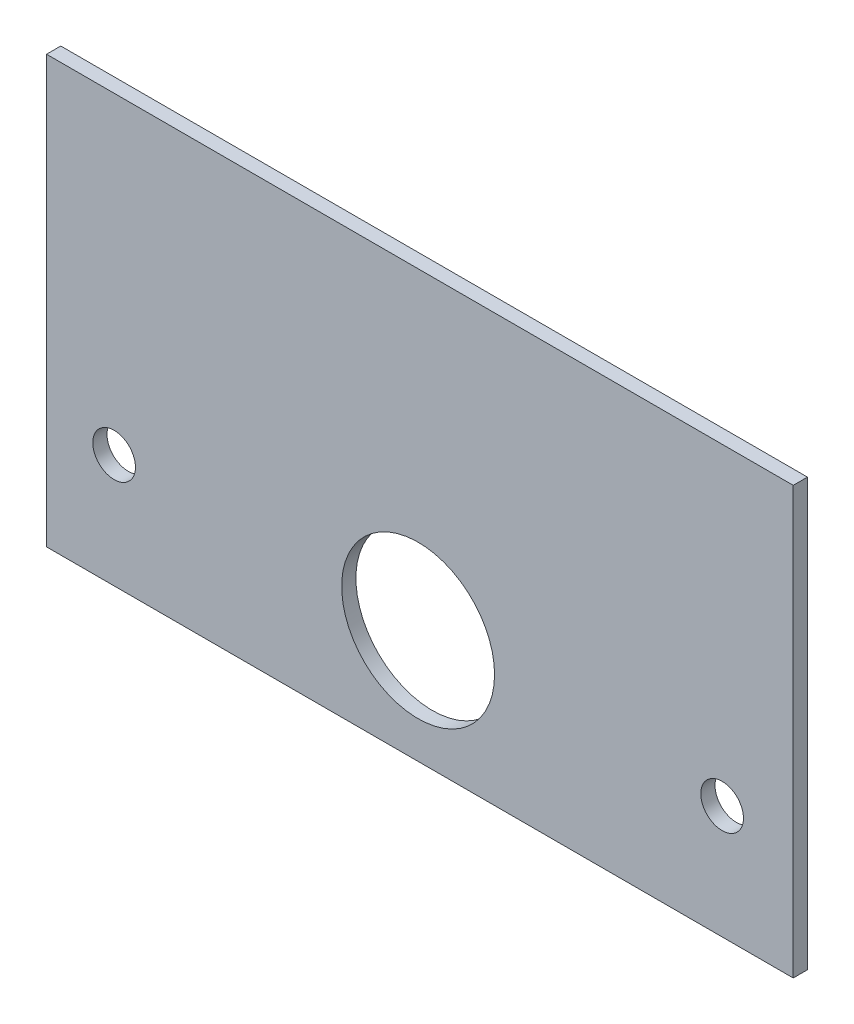
ISO-10303-21;
HEADER;
FILE_DESCRIPTION(('STEP AP214'),'2;1');
FILE_NAME('part.step','',(''),(''),'','','');
FILE_SCHEMA(('AUTOMOTIVE_DESIGN { 1 0 10303 214 1 1 1 1 }'));
ENDSEC;
DATA;
#1=APPLICATION_CONTEXT('core data for automotive mechanical design processes');
#2=APPLICATION_PROTOCOL_DEFINITION('international standard','automotive_design',2000,#1);
#3=PRODUCT_CONTEXT('',#1,'mechanical');
#4=PRODUCT('Part','Part','',(#3));
#5=PRODUCT_RELATED_PRODUCT_CATEGORY('part','',(#4));
#6=PRODUCT_DEFINITION_FORMATION('','',#4);
#7=PRODUCT_DEFINITION_CONTEXT('part definition',#1,'design');
#8=PRODUCT_DEFINITION('design','',#6,#7);
#9=PRODUCT_DEFINITION_SHAPE('','',#8);
#10=(LENGTH_UNIT() NAMED_UNIT(*) SI_UNIT(.MILLI.,.METRE.));
#11=(NAMED_UNIT(*) PLANE_ANGLE_UNIT() SI_UNIT($,.RADIAN.));
#12=(NAMED_UNIT(*) SI_UNIT($,.STERADIAN.) SOLID_ANGLE_UNIT());
#13=UNCERTAINTY_MEASURE_WITH_UNIT(LENGTH_MEASURE(1.E-05),#10,'distance_accuracy_value','');
#14=(GEOMETRIC_REPRESENTATION_CONTEXT(3) GLOBAL_UNCERTAINTY_ASSIGNED_CONTEXT((#13)) GLOBAL_UNIT_ASSIGNED_CONTEXT((#10,
#11,#12)) REPRESENTATION_CONTEXT('',''));
#15=CARTESIAN_POINT('',(0.,0.,0.));
#16=DIRECTION('',(0.,0.,1.));
#17=DIRECTION('',(1.,0.,0.));
#18=AXIS2_PLACEMENT_3D('',#15,#16,#17);
#19=CARTESIAN_POINT('',(0.,0.,2.));
#20=DIRECTION('',(0.,0.,-1.));
#21=DIRECTION('',(-1.,0.,0.));
#22=AXIS2_PLACEMENT_3D('',#19,#20,#21);
#23=PLANE('',#22);
#24=DIRECTION('',(0.,1.,0.));
#25=VECTOR('',#24,1.);
#26=CARTESIAN_POINT('',(0.,0.,2.));
#27=LINE('',#26,#25);
#28=CARTESIAN_POINT('',(0.,-60.,2.));
#29=VERTEX_POINT('',#28);
#30=CARTESIAN_POINT('',(0.,0.,2.));
#31=VERTEX_POINT('',#30);
#32=EDGE_CURVE('E85',#29,#31,#27,.T.);
#33=ORIENTED_EDGE('',*,*,#32,.T.);
#34=DIRECTION('',(-1.,0.,0.));
#35=VECTOR('',#34,1.);
#36=CARTESIAN_POINT('',(0.,0.,2.));
#37=LINE('',#36,#35);
#38=CARTESIAN_POINT('',(-105.,0.,2.));
#39=VERTEX_POINT('',#38);
#40=EDGE_CURVE('E80',#31,#39,#37,.T.);
#41=ORIENTED_EDGE('',*,*,#40,.T.);
#42=DIRECTION('',(0.,-1.,0.));
#43=VECTOR('',#42,1.);
#44=CARTESIAN_POINT('',(-105.,0.,2.));
#45=LINE('',#44,#43);
#46=CARTESIAN_POINT('',(-105.,-60.,2.));
#47=VERTEX_POINT('',#46);
#48=EDGE_CURVE('E83',#39,#47,#45,.T.);
#49=ORIENTED_EDGE('',*,*,#48,.T.);
#50=DIRECTION('',(1.,0.,0.));
#51=VECTOR('',#50,1.);
#52=CARTESIAN_POINT('',(0.,-60.,2.));
#53=LINE('',#52,#51);
#54=EDGE_CURVE('E50',#47,#29,#53,.T.);
#55=ORIENTED_EDGE('',*,*,#54,.T.);
#56=EDGE_LOOP('',(#33,#41,#49,#55));
#57=FACE_BOUND('',#56,.T.);
#58=CARTESIAN_POINT('',(-9.99999999999999,-44.05,2.));
#59=DIRECTION('',(0.,0.,1.));
#60=DIRECTION('',(1.,0.,0.));
#61=AXIS2_PLACEMENT_3D('',#58,#59,#60);
#62=CIRCLE('',#61,3.);
#63=CARTESIAN_POINT('',(-6.99999999999999,-44.05,2.));
#64=VERTEX_POINT('',#63);
#65=EDGE_CURVE('E100',#64,#64,#62,.T.);
#66=ORIENTED_EDGE('',*,*,#65,.F.);
#67=EDGE_LOOP('',(#66));
#68=FACE_BOUND('',#67,.T.);
#69=CARTESIAN_POINT('',(-52.75,-44.05,2.));
#70=DIRECTION('',(0.,0.,1.));
#71=DIRECTION('',(1.,0.,0.));
#72=AXIS2_PLACEMENT_3D('',#69,#70,#71);
#73=CIRCLE('',#72,10.75);
#74=CARTESIAN_POINT('',(-42.,-44.05,2.));
#75=VERTEX_POINT('',#74);
#76=EDGE_CURVE('E115',#75,#75,#73,.T.);
#77=ORIENTED_EDGE('',*,*,#76,.F.);
#78=EDGE_LOOP('',(#77));
#79=FACE_BOUND('',#78,.T.);
#80=CARTESIAN_POINT('',(-95.5,-44.05,2.));
#81=DIRECTION('',(0.,0.,1.));
#82=DIRECTION('',(1.,0.,0.));
#83=AXIS2_PLACEMENT_3D('',#80,#81,#82);
#84=CIRCLE('',#83,3.00000000000001);
#85=CARTESIAN_POINT('',(-92.5,-44.05,2.));
#86=VERTEX_POINT('',#85);
#87=EDGE_CURVE('E121',#86,#86,#84,.T.);
#88=ORIENTED_EDGE('',*,*,#87,.F.);
#89=EDGE_LOOP('',(#88));
#90=FACE_BOUND('',#89,.T.);
#91=ADVANCED_FACE('F33',(#57,#68,#79,#90),#23,.F.);
#92=CARTESIAN_POINT('',(0.,0.,0.));
#93=DIRECTION('',(0.,0.,-1.));
#94=DIRECTION('',(-1.,0.,0.));
#95=AXIS2_PLACEMENT_3D('',#92,#93,#94);
#96=PLANE('',#95);
#97=CARTESIAN_POINT('',(-52.75,-44.05,0.));
#98=DIRECTION('',(0.,0.,1.));
#99=DIRECTION('',(1.,0.,0.));
#100=AXIS2_PLACEMENT_3D('',#97,#98,#99);
#101=CIRCLE('',#100,10.75);
#102=CARTESIAN_POINT('',(-42.,-44.05,0.));
#103=VERTEX_POINT('',#102);
#104=EDGE_CURVE('E118',#103,#103,#101,.T.);
#105=ORIENTED_EDGE('',*,*,#104,.T.);
#106=EDGE_LOOP('',(#105));
#107=FACE_BOUND('',#106,.T.);
#108=DIRECTION('',(0.,1.,0.));
#109=VECTOR('',#108,1.);
#110=CARTESIAN_POINT('',(0.,0.,0.));
#111=LINE('',#110,#109);
#112=CARTESIAN_POINT('',(0.,-60.,0.));
#113=VERTEX_POINT('',#112);
#114=CARTESIAN_POINT('',(0.,0.,0.));
#115=VERTEX_POINT('',#114);
#116=EDGE_CURVE('E97',#113,#115,#111,.T.);
#117=ORIENTED_EDGE('',*,*,#116,.F.);
#118=DIRECTION('',(1.,0.,0.));
#119=VECTOR('',#118,1.);
#120=CARTESIAN_POINT('',(0.,-60.,0.));
#121=LINE('',#120,#119);
#122=CARTESIAN_POINT('',(-105.,-60.,0.));
#123=VERTEX_POINT('',#122);
#124=EDGE_CURVE('E73',#123,#113,#121,.T.);
#125=ORIENTED_EDGE('',*,*,#124,.F.);
#126=DIRECTION('',(0.,-1.,0.));
#127=VECTOR('',#126,1.);
#128=CARTESIAN_POINT('',(-105.,0.,0.));
#129=LINE('',#128,#127);
#130=CARTESIAN_POINT('',(-105.,0.,0.));
#131=VERTEX_POINT('',#130);
#132=EDGE_CURVE('E67',#131,#123,#129,.T.);
#133=ORIENTED_EDGE('',*,*,#132,.F.);
#134=DIRECTION('',(-1.,0.,0.));
#135=VECTOR('',#134,1.);
#136=CARTESIAN_POINT('',(0.,0.,0.));
#137=LINE('',#136,#135);
#138=EDGE_CURVE('E89',#115,#131,#137,.T.);
#139=ORIENTED_EDGE('',*,*,#138,.F.);
#140=EDGE_LOOP('',(#117,#125,#133,#139));
#141=FACE_BOUND('',#140,.T.);
#142=CARTESIAN_POINT('',(-9.99999999999999,-44.05,0.));
#143=DIRECTION('',(0.,0.,1.));
#144=DIRECTION('',(1.,0.,0.));
#145=AXIS2_PLACEMENT_3D('',#142,#143,#144);
#146=CIRCLE('',#145,3.);
#147=CARTESIAN_POINT('',(-6.99999999999999,-44.05,0.));
#148=VERTEX_POINT('',#147);
#149=EDGE_CURVE('E112',#148,#148,#146,.T.);
#150=ORIENTED_EDGE('',*,*,#149,.T.);
#151=EDGE_LOOP('',(#150));
#152=FACE_BOUND('',#151,.T.);
#153=CARTESIAN_POINT('',(-95.5,-44.05,0.));
#154=DIRECTION('',(0.,0.,1.));
#155=DIRECTION('',(1.,0.,0.));
#156=AXIS2_PLACEMENT_3D('',#153,#154,#155);
#157=CIRCLE('',#156,3.00000000000001);
#158=CARTESIAN_POINT('',(-92.5,-44.05,0.));
#159=VERTEX_POINT('',#158);
#160=EDGE_CURVE('E124',#159,#159,#157,.T.);
#161=ORIENTED_EDGE('',*,*,#160,.T.);
#162=EDGE_LOOP('',(#161));
#163=FACE_BOUND('',#162,.T.);
#164=ADVANCED_FACE('F108',(#107,#141,#152,#163),#96,.T.);
#165=CARTESIAN_POINT('',(0.,0.,2.));
#166=DIRECTION('',(-1.,0.,0.));
#167=DIRECTION('',(0.,-1.,0.));
#168=AXIS2_PLACEMENT_3D('',#165,#166,#167);
#169=PLANE('',#168);
#170=ORIENTED_EDGE('',*,*,#116,.T.);
#171=DIRECTION('',(0.,0.,-1.));
#172=VECTOR('',#171,1.);
#173=CARTESIAN_POINT('',(0.,0.,2.));
#174=LINE('',#173,#172);
#175=EDGE_CURVE('E11',#31,#115,#174,.T.);
#176=ORIENTED_EDGE('',*,*,#175,.F.);
#177=ORIENTED_EDGE('',*,*,#32,.F.);
#178=DIRECTION('',(0.,0.,-1.));
#179=VECTOR('',#178,1.);
#180=CARTESIAN_POINT('',(0.,-60.,2.));
#181=LINE('',#180,#179);
#182=EDGE_CURVE('E93',#29,#113,#181,.T.);
#183=ORIENTED_EDGE('',*,*,#182,.T.);
#184=EDGE_LOOP('',(#170,#176,#177,#183));
#185=FACE_BOUND('',#184,.T.);
#186=ADVANCED_FACE('F35',(#185),#169,.F.);
#187=CARTESIAN_POINT('',(0.,0.,2.));
#188=DIRECTION('',(0.,-1.,0.));
#189=DIRECTION('',(1.,0.,0.));
#190=AXIS2_PLACEMENT_3D('',#187,#188,#189);
#191=PLANE('',#190);
#192=ORIENTED_EDGE('',*,*,#138,.T.);
#193=DIRECTION('',(0.,0.,-1.));
#194=VECTOR('',#193,1.);
#195=CARTESIAN_POINT('',(-105.,0.,2.));
#196=LINE('',#195,#194);
#197=EDGE_CURVE('E42',#39,#131,#196,.T.);
#198=ORIENTED_EDGE('',*,*,#197,.F.);
#199=ORIENTED_EDGE('',*,*,#40,.F.);
#200=ORIENTED_EDGE('',*,*,#175,.T.);
#201=EDGE_LOOP('',(#192,#198,#199,#200));
#202=FACE_BOUND('',#201,.T.);
#203=ADVANCED_FACE('F88',(#202),#191,.F.);
#204=CARTESIAN_POINT('',(-105.,0.,2.));
#205=DIRECTION('',(1.,0.,0.));
#206=DIRECTION('',(0.,1.,0.));
#207=AXIS2_PLACEMENT_3D('',#204,#205,#206);
#208=PLANE('',#207);
#209=ORIENTED_EDGE('',*,*,#132,.T.);
#210=DIRECTION('',(0.,0.,-1.));
#211=VECTOR('',#210,1.);
#212=CARTESIAN_POINT('',(-105.,-60.,2.));
#213=LINE('',#212,#211);
#214=EDGE_CURVE('E90',#47,#123,#213,.T.);
#215=ORIENTED_EDGE('',*,*,#214,.F.);
#216=ORIENTED_EDGE('',*,*,#48,.F.);
#217=ORIENTED_EDGE('',*,*,#197,.T.);
#218=EDGE_LOOP('',(#209,#215,#216,#217));
#219=FACE_BOUND('',#218,.T.);
#220=ADVANCED_FACE('F91',(#219),#208,.F.);
#221=CARTESIAN_POINT('',(0.,-60.,2.));
#222=DIRECTION('',(0.,1.,0.));
#223=DIRECTION('',(-1.,0.,0.));
#224=AXIS2_PLACEMENT_3D('',#221,#222,#223);
#225=PLANE('',#224);
#226=ORIENTED_EDGE('',*,*,#124,.T.);
#227=ORIENTED_EDGE('',*,*,#182,.F.);
#228=ORIENTED_EDGE('',*,*,#54,.F.);
#229=ORIENTED_EDGE('',*,*,#214,.T.);
#230=EDGE_LOOP('',(#226,#227,#228,#229));
#231=FACE_BOUND('',#230,.T.);
#232=ADVANCED_FACE('F105',(#231),#225,.F.);
#233=CARTESIAN_POINT('',(-9.99999999999999,-44.05,2.));
#234=DIRECTION('',(0.,0.,-1.));
#235=DIRECTION('',(-1.,0.,0.));
#236=AXIS2_PLACEMENT_3D('',#233,#234,#235);
#237=CYLINDRICAL_SURFACE('',#236,3.);
#238=ORIENTED_EDGE('',*,*,#65,.T.);
#239=EDGE_LOOP('',(#238));
#240=FACE_BOUND('',#239,.T.);
#241=ORIENTED_EDGE('',*,*,#149,.F.);
#242=EDGE_LOOP('',(#241));
#243=FACE_BOUND('',#242,.T.);
#244=ADVANCED_FACE('F141',(#240,#243),#237,.F.);
#245=CARTESIAN_POINT('',(-52.75,-44.05,2.));
#246=DIRECTION('',(0.,0.,-1.));
#247=DIRECTION('',(-1.,0.,0.));
#248=AXIS2_PLACEMENT_3D('',#245,#246,#247);
#249=CYLINDRICAL_SURFACE('',#248,10.75);
#250=ORIENTED_EDGE('',*,*,#76,.T.);
#251=EDGE_LOOP('',(#250));
#252=FACE_BOUND('',#251,.T.);
#253=ORIENTED_EDGE('',*,*,#104,.F.);
#254=EDGE_LOOP('',(#253));
#255=FACE_BOUND('',#254,.T.);
#256=ADVANCED_FACE('F187',(#252,#255),#249,.F.);
#257=CARTESIAN_POINT('',(-95.5,-44.05,2.));
#258=DIRECTION('',(0.,0.,-1.));
#259=DIRECTION('',(-1.,0.,0.));
#260=AXIS2_PLACEMENT_3D('',#257,#258,#259);
#261=CYLINDRICAL_SURFACE('',#260,3.00000000000001);
#262=ORIENTED_EDGE('',*,*,#87,.T.);
#263=EDGE_LOOP('',(#262));
#264=FACE_BOUND('',#263,.T.);
#265=ORIENTED_EDGE('',*,*,#160,.F.);
#266=EDGE_LOOP('',(#265));
#267=FACE_BOUND('',#266,.T.);
#268=ADVANCED_FACE('F130',(#264,#267),#261,.F.);
#269=CLOSED_SHELL('',(#91,#164,#186,#203,#220,#232,#244,#256,#268));
#270=MANIFOLD_SOLID_BREP('B2',#269);
#271=ADVANCED_BREP_SHAPE_REPRESENTATION('',(#18,#270),#14);
#272=SHAPE_DEFINITION_REPRESENTATION(#9,#271);
ENDSEC;
END-ISO-10303-21;
